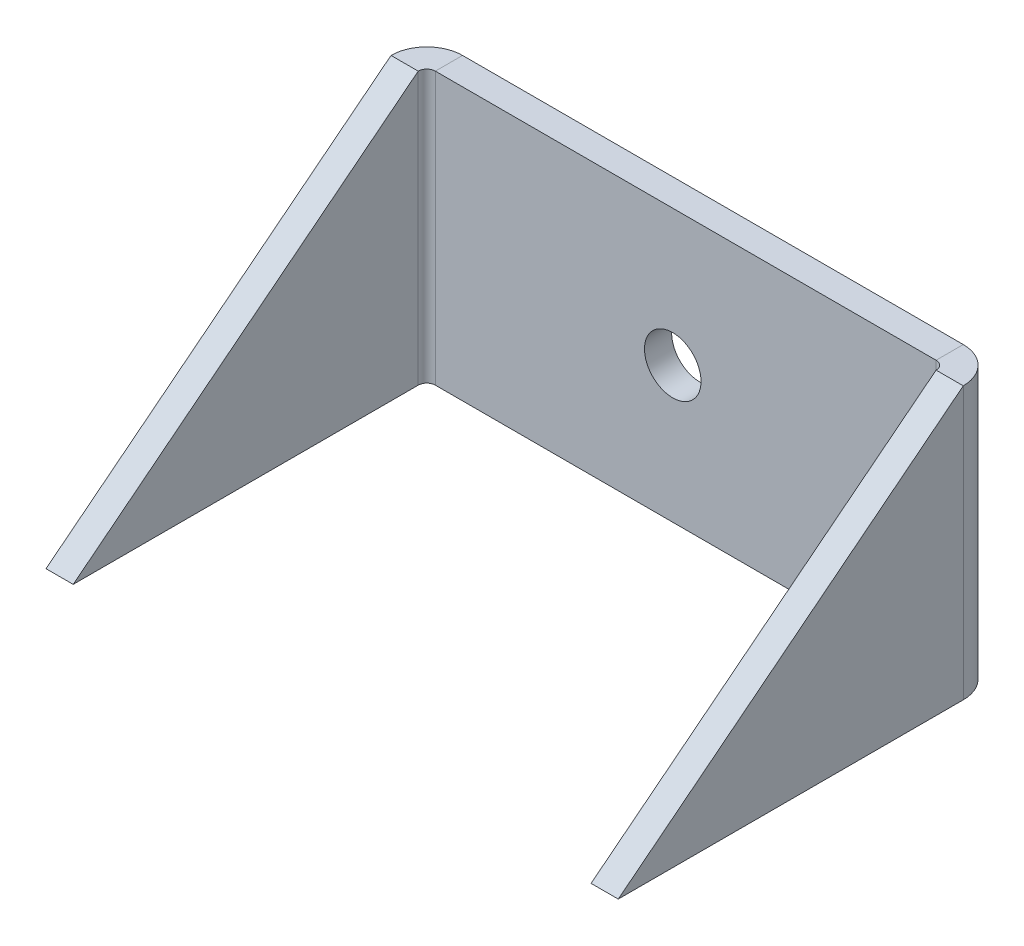
ISO-10303-21;
HEADER;
FILE_DESCRIPTION(('STEP AP214'),'2;1');
FILE_NAME('part.step','',(''),(''),'','','');
FILE_SCHEMA(('AUTOMOTIVE_DESIGN { 1 0 10303 214 1 1 1 1 }'));
ENDSEC;
DATA;
#1=APPLICATION_CONTEXT('core data for automotive mechanical design processes');
#2=APPLICATION_PROTOCOL_DEFINITION('international standard','automotive_design',2000,#1);
#3=PRODUCT_CONTEXT('',#1,'mechanical');
#4=PRODUCT('Part','Part','',(#3));
#5=PRODUCT_RELATED_PRODUCT_CATEGORY('part','',(#4));
#6=PRODUCT_DEFINITION_FORMATION('','',#4);
#7=PRODUCT_DEFINITION_CONTEXT('part definition',#1,'design');
#8=PRODUCT_DEFINITION('design','',#6,#7);
#9=PRODUCT_DEFINITION_SHAPE('','',#8);
#10=(LENGTH_UNIT() NAMED_UNIT(*) SI_UNIT(.MILLI.,.METRE.));
#11=(NAMED_UNIT(*) PLANE_ANGLE_UNIT() SI_UNIT($,.RADIAN.));
#12=(NAMED_UNIT(*) SI_UNIT($,.STERADIAN.) SOLID_ANGLE_UNIT());
#13=UNCERTAINTY_MEASURE_WITH_UNIT(LENGTH_MEASURE(1.E-05),#10,'distance_accuracy_value','');
#14=(GEOMETRIC_REPRESENTATION_CONTEXT(3) GLOBAL_UNCERTAINTY_ASSIGNED_CONTEXT((#13)) GLOBAL_UNIT_ASSIGNED_CONTEXT((#10,
#11,#12)) REPRESENTATION_CONTEXT('',''));
#15=CARTESIAN_POINT('',(0.,0.,0.));
#16=DIRECTION('',(0.,0.,1.));
#17=DIRECTION('',(1.,0.,0.));
#18=AXIS2_PLACEMENT_3D('',#15,#16,#17);
#19=CARTESIAN_POINT('',(-33.401,0.,-1.17794966271529E-13));
#20=DIRECTION('',(1.,0.,0.));
#21=DIRECTION('',(0.,0.,1.));
#22=AXIS2_PLACEMENT_3D('',#19,#20,#21);
#23=PLANE('',#22);
#24=DIRECTION('',(0.,-0.619090944115098,0.785319299975924));
#25=VECTOR('',#24,1.);
#26=CARTESIAN_POINT('',(-33.401,11.8203501253857,9.31833932913692));
#27=LINE('',#26,#25);
#28=CARTESIAN_POINT('',(-33.4010000000001,15.875,4.17499999999998));
#29=VERTEX_POINT('',#28);
#30=CARTESIAN_POINT('',(-33.4010000000001,-15.875,44.45));
#31=VERTEX_POINT('',#30);
#32=EDGE_CURVE('E128',#29,#31,#27,.T.);
#33=ORIENTED_EDGE('',*,*,#32,.F.);
#34=DIRECTION('',(0.,1.,0.));
#35=VECTOR('',#34,1.);
#36=CARTESIAN_POINT('',(-33.401,0.,4.17499999999998));
#37=LINE('',#36,#35);
#38=CARTESIAN_POINT('',(-33.401,-15.875,4.17499999999998));
#39=VERTEX_POINT('',#38);
#40=EDGE_CURVE('E151',#39,#29,#37,.T.);
#41=ORIENTED_EDGE('',*,*,#40,.F.);
#42=DIRECTION('',(0.,0.,-1.));
#43=VECTOR('',#42,1.);
#44=CARTESIAN_POINT('',(-33.401,-15.875,3.17499999999999));
#45=LINE('',#44,#43);
#46=EDGE_CURVE('E135',#31,#39,#45,.T.);
#47=ORIENTED_EDGE('',*,*,#46,.F.);
#48=EDGE_LOOP('',(#33,#41,#47));
#49=FACE_BOUND('',#48,.T.);
#50=ADVANCED_FACE('F42',(#49),#23,.F.);
#51=CARTESIAN_POINT('',(-30.226,0.,-1.06709513020702E-13));
#52=DIRECTION('',(1.,0.,0.));
#53=DIRECTION('',(0.,0.,1.));
#54=AXIS2_PLACEMENT_3D('',#51,#52,#53);
#55=PLANE('',#54);
#56=DIRECTION('',(0.,-1.,0.));
#57=VECTOR('',#56,1.);
#58=CARTESIAN_POINT('',(-30.226,15.875,4.17499999999999));
#59=LINE('',#58,#57);
#60=CARTESIAN_POINT('',(-30.226,15.875,4.17499999999999));
#61=VERTEX_POINT('',#60);
#62=CARTESIAN_POINT('',(-30.226,-15.875,4.17499999999999));
#63=VERTEX_POINT('',#62);
#64=EDGE_CURVE('E142',#61,#63,#59,.T.);
#65=ORIENTED_EDGE('',*,*,#64,.F.);
#66=DIRECTION('',(0.,-0.619090944115099,0.785319299975924));
#67=VECTOR('',#66,1.);
#68=CARTESIAN_POINT('',(-30.226,11.8203501253857,9.31833932913694));
#69=LINE('',#68,#67);
#70=CARTESIAN_POINT('',(-30.2260000000001,-15.875,44.45));
#71=VERTEX_POINT('',#70);
#72=EDGE_CURVE('E125',#61,#71,#69,.T.);
#73=ORIENTED_EDGE('',*,*,#72,.T.);
#74=DIRECTION('',(0.,0.,-1.));
#75=VECTOR('',#74,1.);
#76=CARTESIAN_POINT('',(-30.226,-15.875,3.175));
#77=LINE('',#76,#75);
#78=EDGE_CURVE('E141',#71,#63,#77,.T.);
#79=ORIENTED_EDGE('',*,*,#78,.T.);
#80=EDGE_LOOP('',(#65,#73,#79));
#81=FACE_BOUND('',#80,.T.);
#82=ADVANCED_FACE('F140',(#81),#55,.T.);
#83=CARTESIAN_POINT('',(-30.226,15.875,3.175));
#84=DIRECTION('',(0.,-1.,0.));
#85=DIRECTION('',(0.,0.,-1.));
#86=AXIS2_PLACEMENT_3D('',#83,#84,#85);
#87=PLANE('',#86);
#88=DIRECTION('',(0.,0.,-1.));
#89=VECTOR('',#88,1.);
#90=CARTESIAN_POINT('',(-29.226,15.875,3.175));
#91=LINE('',#90,#89);
#92=CARTESIAN_POINT('',(-29.226,15.875,3.175));
#93=VERTEX_POINT('',#92);
#94=CARTESIAN_POINT('',(-29.226,15.875,0.));
#95=VERTEX_POINT('',#94);
#96=EDGE_CURVE('E60',#93,#95,#91,.T.);
#97=ORIENTED_EDGE('',*,*,#96,.F.);
#98=DIRECTION('',(-1.,0.,0.));
#99=VECTOR('',#98,1.);
#100=CARTESIAN_POINT('',(-30.226,15.875,3.175));
#101=LINE('',#100,#99);
#102=CARTESIAN_POINT('',(29.226,15.875,3.175));
#103=VERTEX_POINT('',#102);
#104=EDGE_CURVE('E52',#103,#93,#101,.T.);
#105=ORIENTED_EDGE('',*,*,#104,.F.);
#106=DIRECTION('',(0.,0.,-1.));
#107=VECTOR('',#106,1.);
#108=CARTESIAN_POINT('',(29.226,15.875,3.17499999999999));
#109=LINE('',#108,#107);
#110=CARTESIAN_POINT('',(29.226,15.875,0.));
#111=VERTEX_POINT('',#110);
#112=EDGE_CURVE('E228',#103,#111,#109,.T.);
#113=ORIENTED_EDGE('',*,*,#112,.T.);
#114=DIRECTION('',(-1.,0.,0.));
#115=VECTOR('',#114,1.);
#116=CARTESIAN_POINT('',(-30.226,15.875,0.));
#117=LINE('',#116,#115);
#118=EDGE_CURVE('E247',#111,#95,#117,.T.);
#119=ORIENTED_EDGE('',*,*,#118,.T.);
#120=EDGE_LOOP('',(#97,#105,#113,#119));
#121=FACE_BOUND('',#120,.T.);
#122=ADVANCED_FACE('F44',(#121),#87,.F.);
#123=CARTESIAN_POINT('',(-30.226,-15.875,3.175));
#124=DIRECTION('',(0.,1.,0.));
#125=DIRECTION('',(0.,0.,1.));
#126=AXIS2_PLACEMENT_3D('',#123,#124,#125);
#127=PLANE('',#126);
#128=DIRECTION('',(0.,0.,-1.));
#129=VECTOR('',#128,1.);
#130=CARTESIAN_POINT('',(-29.226,-15.875,3.175));
#131=LINE('',#130,#129);
#132=CARTESIAN_POINT('',(-29.226,-15.875,3.175));
#133=VERTEX_POINT('',#132);
#134=CARTESIAN_POINT('',(-29.226,-15.875,0.));
#135=VERTEX_POINT('',#134);
#136=EDGE_CURVE('E167',#133,#135,#131,.T.);
#137=ORIENTED_EDGE('',*,*,#136,.T.);
#138=DIRECTION('',(1.,0.,0.));
#139=VECTOR('',#138,1.);
#140=CARTESIAN_POINT('',(-30.226,-15.875,0.));
#141=LINE('',#140,#139);
#142=CARTESIAN_POINT('',(29.226,-15.875,0.));
#143=VERTEX_POINT('',#142);
#144=EDGE_CURVE('E46',#135,#143,#141,.T.);
#145=ORIENTED_EDGE('',*,*,#144,.T.);
#146=DIRECTION('',(0.,0.,-1.));
#147=VECTOR('',#146,1.);
#148=CARTESIAN_POINT('',(29.226,-15.875,3.17499999999999));
#149=LINE('',#148,#147);
#150=CARTESIAN_POINT('',(29.226,-15.875,3.175));
#151=VERTEX_POINT('',#150);
#152=EDGE_CURVE('E243',#151,#143,#149,.T.);
#153=ORIENTED_EDGE('',*,*,#152,.F.);
#154=DIRECTION('',(1.,0.,0.));
#155=VECTOR('',#154,1.);
#156=CARTESIAN_POINT('',(-30.226,-15.875,3.175));
#157=LINE('',#156,#155);
#158=EDGE_CURVE('E11',#133,#151,#157,.T.);
#159=ORIENTED_EDGE('',*,*,#158,.F.);
#160=EDGE_LOOP('',(#137,#145,#153,#159));
#161=FACE_BOUND('',#160,.T.);
#162=ADVANCED_FACE('F257',(#161),#127,.F.);
#163=CARTESIAN_POINT('',(0.,0.,3.175));
#164=DIRECTION('',(0.,0.,1.));
#165=DIRECTION('',(1.,0.,0.));
#166=AXIS2_PLACEMENT_3D('',#163,#164,#165);
#167=PLANE('',#166);
#168=CARTESIAN_POINT('',(-1.51460000000001,0.,3.175));
#169=DIRECTION('',(0.,0.,1.));
#170=DIRECTION('',(1.,0.,0.));
#171=AXIS2_PLACEMENT_3D('',#168,#169,#170);
#172=CIRCLE('',#171,3.29999999999999);
#173=CARTESIAN_POINT('',(1.78539999999998,0.,3.175));
#174=VERTEX_POINT('',#173);
#175=EDGE_CURVE('E310',#174,#174,#172,.T.);
#176=ORIENTED_EDGE('',*,*,#175,.F.);
#177=EDGE_LOOP('',(#176));
#178=FACE_BOUND('',#177,.T.);
#179=ORIENTED_EDGE('',*,*,#104,.T.);
#180=DIRECTION('',(0.,-1.,0.));
#181=VECTOR('',#180,1.);
#182=CARTESIAN_POINT('',(-29.226,-15.875,3.175));
#183=LINE('',#182,#181);
#184=EDGE_CURVE('E66',#133,#93,#183,.F.);
#185=ORIENTED_EDGE('',*,*,#184,.F.);
#186=ORIENTED_EDGE('',*,*,#158,.T.);
#187=DIRECTION('',(0.,1.,0.));
#188=VECTOR('',#187,1.);
#189=CARTESIAN_POINT('',(29.226,15.875,3.17499999999999));
#190=LINE('',#189,#188);
#191=EDGE_CURVE('E236',#103,#151,#190,.F.);
#192=ORIENTED_EDGE('',*,*,#191,.F.);
#193=EDGE_LOOP('',(#179,#185,#186,#192));
#194=FACE_BOUND('',#193,.T.);
#195=ADVANCED_FACE('F289',(#178,#194),#167,.T.);
#196=CARTESIAN_POINT('',(0.,0.,0.));
#197=DIRECTION('',(0.,0.,1.));
#198=DIRECTION('',(1.,0.,0.));
#199=AXIS2_PLACEMENT_3D('',#196,#197,#198);
#200=PLANE('',#199);
#201=CARTESIAN_POINT('',(-1.51460000000001,0.,0.));
#202=DIRECTION('',(0.,0.,1.));
#203=DIRECTION('',(1.,0.,0.));
#204=AXIS2_PLACEMENT_3D('',#201,#202,#203);
#205=CIRCLE('',#204,3.3);
#206=CARTESIAN_POINT('',(1.78539999999999,0.,0.));
#207=VERTEX_POINT('',#206);
#208=EDGE_CURVE('E144',#207,#207,#205,.T.);
#209=ORIENTED_EDGE('',*,*,#208,.T.);
#210=EDGE_LOOP('',(#209));
#211=FACE_BOUND('',#210,.T.);
#212=DIRECTION('',(0.,-1.,0.));
#213=VECTOR('',#212,1.);
#214=CARTESIAN_POINT('',(-29.226,-15.875,0.));
#215=LINE('',#214,#213);
#216=EDGE_CURVE('E159',#135,#95,#215,.F.);
#217=ORIENTED_EDGE('',*,*,#216,.T.);
#218=ORIENTED_EDGE('',*,*,#118,.F.);
#219=DIRECTION('',(0.,1.,0.));
#220=VECTOR('',#219,1.);
#221=CARTESIAN_POINT('',(29.226,15.875,0.));
#222=LINE('',#221,#220);
#223=EDGE_CURVE('E219',#111,#143,#222,.F.);
#224=ORIENTED_EDGE('',*,*,#223,.T.);
#225=ORIENTED_EDGE('',*,*,#144,.F.);
#226=EDGE_LOOP('',(#217,#218,#224,#225));
#227=FACE_BOUND('',#226,.T.);
#228=ADVANCED_FACE('F262',(#211,#227),#200,.F.);
#229=CARTESIAN_POINT('',(29.226,-15.875,4.175));
#230=DIRECTION('',(0.,-1.,0.));
#231=DIRECTION('',(0.,0.,-1.));
#232=AXIS2_PLACEMENT_3D('',#229,#230,#231);
#233=PLANE('',#232);
#234=DIRECTION('',(1.,0.,0.));
#235=VECTOR('',#234,1.);
#236=CARTESIAN_POINT('',(30.226,-15.875,4.17499999999999));
#237=LINE('',#236,#235);
#238=CARTESIAN_POINT('',(30.226,-15.875,4.17499999999999));
#239=VERTEX_POINT('',#238);
#240=CARTESIAN_POINT('',(33.401,-15.875,4.17499999999998));
#241=VERTEX_POINT('',#240);
#242=EDGE_CURVE('E191',#239,#241,#237,.T.);
#243=ORIENTED_EDGE('',*,*,#242,.F.);
#244=CARTESIAN_POINT('',(29.226,-15.875,4.175));
#245=DIRECTION('',(0.,1.,0.));
#246=DIRECTION('',(0.,0.,1.));
#247=AXIS2_PLACEMENT_3D('',#244,#245,#246);
#248=CIRCLE('',#247,1.);
#249=EDGE_CURVE('E232',#151,#239,#248,.F.);
#250=ORIENTED_EDGE('',*,*,#249,.F.);
#251=ORIENTED_EDGE('',*,*,#152,.T.);
#252=CARTESIAN_POINT('',(29.226,-15.875,4.175));
#253=DIRECTION('',(0.,1.,0.));
#254=DIRECTION('',(0.,0.,1.));
#255=AXIS2_PLACEMENT_3D('',#252,#253,#254);
#256=CIRCLE('',#255,4.175);
#257=EDGE_CURVE('E223',#143,#241,#256,.F.);
#258=ORIENTED_EDGE('',*,*,#257,.T.);
#259=EDGE_LOOP('',(#243,#250,#251,#258));
#260=FACE_BOUND('',#259,.T.);
#261=ADVANCED_FACE('F268',(#260),#233,.T.);
#262=CARTESIAN_POINT('',(29.226,15.875,4.175));
#263=DIRECTION('',(0.,-1.,0.));
#264=DIRECTION('',(0.,0.,-1.));
#265=AXIS2_PLACEMENT_3D('',#262,#263,#264);
#266=PLANE('',#265);
#267=CARTESIAN_POINT('',(29.226,15.875,4.175));
#268=DIRECTION('',(0.,1.,0.));
#269=DIRECTION('',(0.,0.,1.));
#270=AXIS2_PLACEMENT_3D('',#267,#268,#269);
#271=CIRCLE('',#270,1.);
#272=CARTESIAN_POINT('',(30.226,15.875,4.17499999999999));
#273=VERTEX_POINT('',#272);
#274=EDGE_CURVE('E218',#273,#103,#271,.T.);
#275=ORIENTED_EDGE('',*,*,#274,.F.);
#276=DIRECTION('',(1.,0.,0.));
#277=VECTOR('',#276,1.);
#278=CARTESIAN_POINT('',(30.226,15.875,4.17499999999999));
#279=LINE('',#278,#277);
#280=CARTESIAN_POINT('',(33.4010000000001,15.875,4.17499999999998));
#281=VERTEX_POINT('',#280);
#282=EDGE_CURVE('E196',#273,#281,#279,.T.);
#283=ORIENTED_EDGE('',*,*,#282,.T.);
#284=CARTESIAN_POINT('',(29.226,15.875,4.175));
#285=DIRECTION('',(0.,1.,0.));
#286=DIRECTION('',(0.,0.,1.));
#287=AXIS2_PLACEMENT_3D('',#284,#285,#286);
#288=CIRCLE('',#287,4.175);
#289=EDGE_CURVE('E224',#281,#111,#288,.T.);
#290=ORIENTED_EDGE('',*,*,#289,.T.);
#291=ORIENTED_EDGE('',*,*,#112,.F.);
#292=EDGE_LOOP('',(#275,#283,#290,#291));
#293=FACE_BOUND('',#292,.T.);
#294=ADVANCED_FACE('F287',(#293),#266,.F.);
#295=CARTESIAN_POINT('',(29.226,15.875,4.175));
#296=DIRECTION('',(0.,1.,0.));
#297=DIRECTION('',(1.,0.,0.));
#298=AXIS2_PLACEMENT_3D('',#295,#296,#297);
#299=CYLINDRICAL_SURFACE('',#298,4.175);
#300=ORIENTED_EDGE('',*,*,#223,.F.);
#301=ORIENTED_EDGE('',*,*,#289,.F.);
#302=DIRECTION('',(0.,-1.,0.));
#303=VECTOR('',#302,1.);
#304=CARTESIAN_POINT('',(33.401,0.,4.17499999999998));
#305=LINE('',#304,#303);
#306=EDGE_CURVE('E200',#281,#241,#305,.T.);
#307=ORIENTED_EDGE('',*,*,#306,.T.);
#308=ORIENTED_EDGE('',*,*,#257,.F.);
#309=EDGE_LOOP('',(#300,#301,#307,#308));
#310=FACE_BOUND('',#309,.T.);
#311=ADVANCED_FACE('F269',(#310),#299,.T.);
#312=CARTESIAN_POINT('',(29.226,15.875,4.175));
#313=DIRECTION('',(0.,1.,0.));
#314=DIRECTION('',(1.,0.,0.));
#315=AXIS2_PLACEMENT_3D('',#312,#313,#314);
#316=CYLINDRICAL_SURFACE('',#315,1.);
#317=ORIENTED_EDGE('',*,*,#191,.T.);
#318=ORIENTED_EDGE('',*,*,#249,.T.);
#319=DIRECTION('',(0.,1.,0.));
#320=VECTOR('',#319,1.);
#321=CARTESIAN_POINT('',(30.226,-15.875,4.17499999999999));
#322=LINE('',#321,#320);
#323=EDGE_CURVE('E192',#239,#273,#322,.T.);
#324=ORIENTED_EDGE('',*,*,#323,.T.);
#325=ORIENTED_EDGE('',*,*,#274,.T.);
#326=EDGE_LOOP('',(#317,#318,#324,#325));
#327=FACE_BOUND('',#326,.T.);
#328=ADVANCED_FACE('F279',(#327),#316,.F.);
#329=CARTESIAN_POINT('',(33.401,-15.875,3.17499999999999));
#330=DIRECTION('',(0.,1.,0.));
#331=DIRECTION('',(-1.,0.,0.));
#332=AXIS2_PLACEMENT_3D('',#329,#330,#331);
#333=PLANE('',#332);
#334=ORIENTED_EDGE('',*,*,#242,.T.);
#335=DIRECTION('',(0.,0.,-1.));
#336=VECTOR('',#335,1.);
#337=CARTESIAN_POINT('',(33.401,-15.875,3.17499999999999));
#338=LINE('',#337,#336);
#339=CARTESIAN_POINT('',(33.4010000000001,-15.875,44.45));
#340=VERTEX_POINT('',#339);
#341=EDGE_CURVE('E207',#340,#241,#338,.T.);
#342=ORIENTED_EDGE('',*,*,#341,.F.);
#343=DIRECTION('',(-1.,0.,0.));
#344=VECTOR('',#343,1.);
#345=CARTESIAN_POINT('',(33.4010000000001,-15.875,44.45));
#346=LINE('',#345,#344);
#347=CARTESIAN_POINT('',(30.2260000000001,-15.875,44.45));
#348=VERTEX_POINT('',#347);
#349=EDGE_CURVE('E211',#340,#348,#346,.T.);
#350=ORIENTED_EDGE('',*,*,#349,.T.);
#351=DIRECTION('',(0.,0.,-1.));
#352=VECTOR('',#351,1.);
#353=CARTESIAN_POINT('',(30.226,-15.875,3.175));
#354=LINE('',#353,#352);
#355=EDGE_CURVE('E206',#348,#239,#354,.T.);
#356=ORIENTED_EDGE('',*,*,#355,.T.);
#357=EDGE_LOOP('',(#334,#342,#350,#356));
#358=FACE_BOUND('',#357,.T.);
#359=ADVANCED_FACE('F275',(#358),#333,.F.);
#360=CARTESIAN_POINT('',(33.401,0.,-1.17794966271529E-13));
#361=DIRECTION('',(-1.,0.,0.));
#362=DIRECTION('',(0.,0.,1.));
#363=AXIS2_PLACEMENT_3D('',#360,#361,#362);
#364=PLANE('',#363);
#365=ORIENTED_EDGE('',*,*,#306,.F.);
#366=DIRECTION('',(0.,-0.619090944115098,0.785319299975924));
#367=VECTOR('',#366,1.);
#368=CARTESIAN_POINT('',(33.401,11.8203501253857,9.31833932913692));
#369=LINE('',#368,#367);
#370=EDGE_CURVE('E187',#281,#340,#369,.T.);
#371=ORIENTED_EDGE('',*,*,#370,.T.);
#372=ORIENTED_EDGE('',*,*,#341,.T.);
#373=EDGE_LOOP('',(#365,#371,#372));
#374=FACE_BOUND('',#373,.T.);
#375=ADVANCED_FACE('F272',(#374),#364,.F.);
#376=CARTESIAN_POINT('',(30.226,0.,-1.06709513020702E-13));
#377=DIRECTION('',(-1.,0.,0.));
#378=DIRECTION('',(0.,0.,1.));
#379=AXIS2_PLACEMENT_3D('',#376,#377,#378);
#380=PLANE('',#379);
#381=DIRECTION('',(0.,-0.619090944115099,0.785319299975924));
#382=VECTOR('',#381,1.);
#383=CARTESIAN_POINT('',(30.226,11.8203501253857,9.31833932913694));
#384=LINE('',#383,#382);
#385=EDGE_CURVE('E182',#273,#348,#384,.T.);
#386=ORIENTED_EDGE('',*,*,#385,.F.);
#387=ORIENTED_EDGE('',*,*,#323,.F.);
#388=ORIENTED_EDGE('',*,*,#355,.F.);
#389=EDGE_LOOP('',(#386,#387,#388));
#390=FACE_BOUND('',#389,.T.);
#391=ADVANCED_FACE('F283',(#390),#380,.T.);
#392=CARTESIAN_POINT('',(33.401012,11.8203501253857,9.31833932913693));
#393=DIRECTION('',(0.,-0.785319299975924,-0.619090944115098));
#394=DIRECTION('',(0.,0.619090944115098,-0.785319299975924));
#395=AXIS2_PLACEMENT_3D('',#392,#393,#394);
#396=PLANE('',#395);
#397=ORIENTED_EDGE('',*,*,#282,.F.);
#398=ORIENTED_EDGE('',*,*,#385,.T.);
#399=ORIENTED_EDGE('',*,*,#349,.F.);
#400=ORIENTED_EDGE('',*,*,#370,.F.);
#401=EDGE_LOOP('',(#397,#398,#399,#400));
#402=FACE_BOUND('',#401,.T.);
#403=ADVANCED_FACE('F285',(#402),#396,.F.);
#404=CARTESIAN_POINT('',(-29.226,15.875,4.175));
#405=DIRECTION('',(0.,1.,0.));
#406=DIRECTION('',(0.,0.,1.));
#407=AXIS2_PLACEMENT_3D('',#404,#405,#406);
#408=PLANE('',#407);
#409=DIRECTION('',(-1.,0.,0.));
#410=VECTOR('',#409,1.);
#411=CARTESIAN_POINT('',(-30.226,15.875,4.17499999999999));
#412=LINE('',#411,#410);
#413=EDGE_CURVE('E297',#61,#29,#412,.T.);
#414=ORIENTED_EDGE('',*,*,#413,.F.);
#415=CARTESIAN_POINT('',(-29.226,15.875,4.175));
#416=DIRECTION('',(0.,-1.,0.));
#417=DIRECTION('',(0.,0.,-1.));
#418=AXIS2_PLACEMENT_3D('',#415,#416,#417);
#419=CIRCLE('',#418,0.999999999999997);
#420=EDGE_CURVE('E171',#93,#61,#419,.F.);
#421=ORIENTED_EDGE('',*,*,#420,.F.);
#422=ORIENTED_EDGE('',*,*,#96,.T.);
#423=CARTESIAN_POINT('',(-29.226,15.875,4.175));
#424=DIRECTION('',(0.,-1.,0.));
#425=DIRECTION('',(0.,0.,-1.));
#426=AXIS2_PLACEMENT_3D('',#423,#424,#425);
#427=CIRCLE('',#426,4.175);
#428=EDGE_CURVE('E162',#95,#29,#427,.F.);
#429=ORIENTED_EDGE('',*,*,#428,.T.);
#430=EDGE_LOOP('',(#414,#421,#422,#429));
#431=FACE_BOUND('',#430,.T.);
#432=ADVANCED_FACE('F295',(#431),#408,.T.);
#433=CARTESIAN_POINT('',(-29.226,-15.875,4.175));
#434=DIRECTION('',(0.,1.,0.));
#435=DIRECTION('',(0.,0.,1.));
#436=AXIS2_PLACEMENT_3D('',#433,#434,#435);
#437=PLANE('',#436);
#438=CARTESIAN_POINT('',(-29.226,-15.875,4.175));
#439=DIRECTION('',(0.,-1.,0.));
#440=DIRECTION('',(0.,0.,-1.));
#441=AXIS2_PLACEMENT_3D('',#438,#439,#440);
#442=CIRCLE('',#441,0.999999999999997);
#443=EDGE_CURVE('E134',#63,#133,#442,.T.);
#444=ORIENTED_EDGE('',*,*,#443,.F.);
#445=DIRECTION('',(-1.,0.,0.));
#446=VECTOR('',#445,1.);
#447=CARTESIAN_POINT('',(-30.226,-15.875,4.17499999999999));
#448=LINE('',#447,#446);
#449=EDGE_CURVE('E149',#63,#39,#448,.T.);
#450=ORIENTED_EDGE('',*,*,#449,.T.);
#451=CARTESIAN_POINT('',(-29.226,-15.875,4.175));
#452=DIRECTION('',(0.,-1.,0.));
#453=DIRECTION('',(0.,0.,-1.));
#454=AXIS2_PLACEMENT_3D('',#451,#452,#453);
#455=CIRCLE('',#454,4.175);
#456=EDGE_CURVE('E163',#39,#135,#455,.T.);
#457=ORIENTED_EDGE('',*,*,#456,.T.);
#458=ORIENTED_EDGE('',*,*,#136,.F.);
#459=EDGE_LOOP('',(#444,#450,#457,#458));
#460=FACE_BOUND('',#459,.T.);
#461=ADVANCED_FACE('F341',(#460),#437,.F.);
#462=CARTESIAN_POINT('',(-29.226,-15.875,4.175));
#463=DIRECTION('',(0.,-1.,0.));
#464=DIRECTION('',(-1.,0.,0.));
#465=AXIS2_PLACEMENT_3D('',#462,#463,#464);
#466=CYLINDRICAL_SURFACE('',#465,4.175);
#467=ORIENTED_EDGE('',*,*,#216,.F.);
#468=ORIENTED_EDGE('',*,*,#456,.F.);
#469=ORIENTED_EDGE('',*,*,#40,.T.);
#470=ORIENTED_EDGE('',*,*,#428,.F.);
#471=EDGE_LOOP('',(#467,#468,#469,#470));
#472=FACE_BOUND('',#471,.T.);
#473=ADVANCED_FACE('F338',(#472),#466,.T.);
#474=CARTESIAN_POINT('',(-29.226,-15.875,4.175));
#475=DIRECTION('',(0.,-1.,0.));
#476=DIRECTION('',(-1.,0.,0.));
#477=AXIS2_PLACEMENT_3D('',#474,#475,#476);
#478=CYLINDRICAL_SURFACE('',#477,0.999999999999997);
#479=ORIENTED_EDGE('',*,*,#184,.T.);
#480=ORIENTED_EDGE('',*,*,#420,.T.);
#481=ORIENTED_EDGE('',*,*,#64,.T.);
#482=ORIENTED_EDGE('',*,*,#443,.T.);
#483=EDGE_LOOP('',(#479,#480,#481,#482));
#484=FACE_BOUND('',#483,.T.);
#485=ADVANCED_FACE('F292',(#484),#478,.F.);
#486=CARTESIAN_POINT('',(-33.401,-15.875,3.17499999999999));
#487=DIRECTION('',(0.,-1.,0.));
#488=DIRECTION('',(1.,0.,0.));
#489=AXIS2_PLACEMENT_3D('',#486,#487,#488);
#490=PLANE('',#489);
#491=ORIENTED_EDGE('',*,*,#46,.T.);
#492=ORIENTED_EDGE('',*,*,#449,.F.);
#493=ORIENTED_EDGE('',*,*,#78,.F.);
#494=DIRECTION('',(1.,0.,0.));
#495=VECTOR('',#494,1.);
#496=CARTESIAN_POINT('',(-33.4010000000001,-15.875,44.45));
#497=LINE('',#496,#495);
#498=EDGE_CURVE('E122',#31,#71,#497,.T.);
#499=ORIENTED_EDGE('',*,*,#498,.F.);
#500=EDGE_LOOP('',(#491,#492,#493,#499));
#501=FACE_BOUND('',#500,.T.);
#502=ADVANCED_FACE('F147',(#501),#490,.T.);
#503=CARTESIAN_POINT('',(-33.401012,11.8203501253857,9.31833932913693));
#504=DIRECTION('',(0.,0.785319299975924,0.619090944115098));
#505=DIRECTION('',(0.,-0.619090944115098,0.785319299975924));
#506=AXIS2_PLACEMENT_3D('',#503,#504,#505);
#507=PLANE('',#506);
#508=ORIENTED_EDGE('',*,*,#32,.T.);
#509=ORIENTED_EDGE('',*,*,#498,.T.);
#510=ORIENTED_EDGE('',*,*,#72,.F.);
#511=ORIENTED_EDGE('',*,*,#413,.T.);
#512=EDGE_LOOP('',(#508,#509,#510,#511));
#513=FACE_BOUND('',#512,.T.);
#514=ADVANCED_FACE('F124',(#513),#507,.T.);
#515=CARTESIAN_POINT('',(-1.51460000000001,0.,3.175));
#516=DIRECTION('',(0.,0.,1.));
#517=DIRECTION('',(1.,0.,0.));
#518=AXIS2_PLACEMENT_3D('',#515,#516,#517);
#519=CYLINDRICAL_SURFACE('',#518,3.29999999999999);
#520=ORIENTED_EDGE('',*,*,#208,.F.);
#521=EDGE_LOOP('',(#520));
#522=FACE_BOUND('',#521,.T.);
#523=ORIENTED_EDGE('',*,*,#175,.T.);
#524=EDGE_LOOP('',(#523));
#525=FACE_BOUND('',#524,.T.);
#526=ADVANCED_FACE('F315',(#522,#525),#519,.F.);
#527=CLOSED_SHELL('',(#50,#82,#122,#162,#195,#228,#261,#294,#311,#328,#359,#375,#391,#403,#432,
#461,#473,#485,#502,#514,#526));
#528=MANIFOLD_SOLID_BREP('B2',#527);
#529=ADVANCED_BREP_SHAPE_REPRESENTATION('',(#18,#528),#14);
#530=SHAPE_DEFINITION_REPRESENTATION(#9,#529);
ENDSEC;
END-ISO-10303-21;
